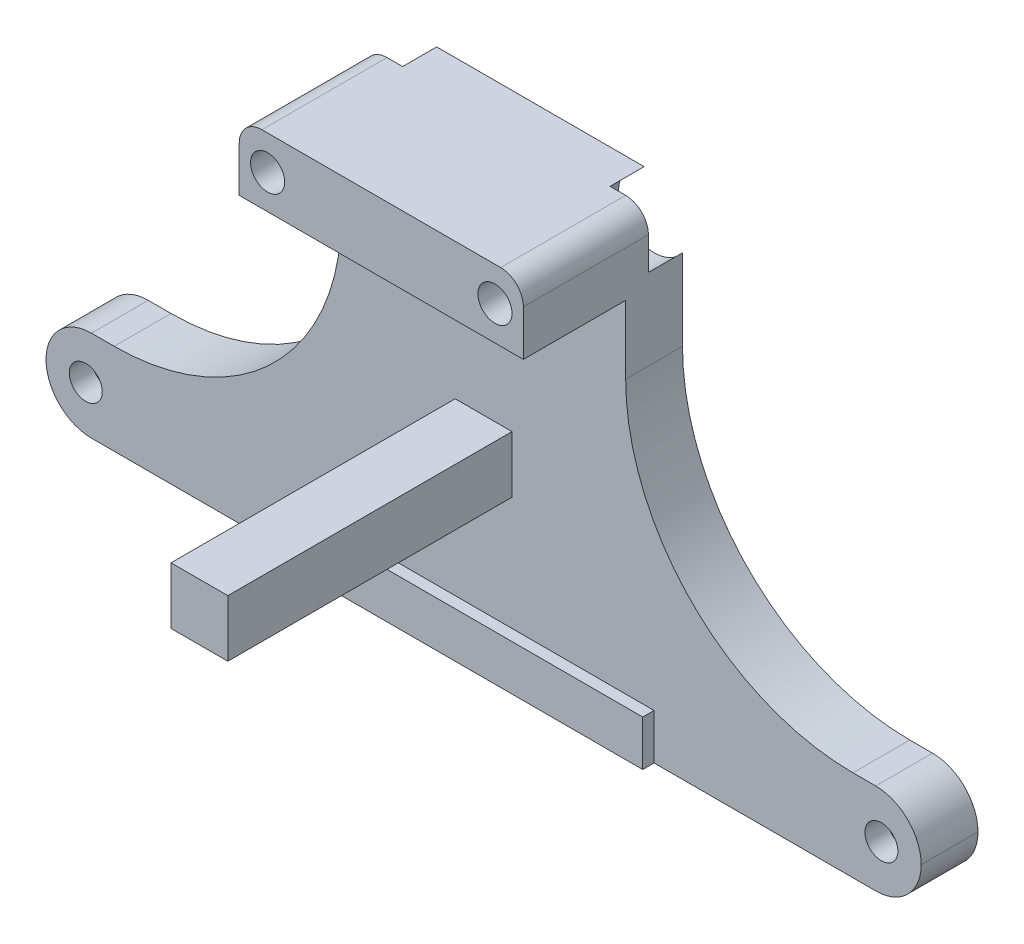
ISO-10303-21;
HEADER;
FILE_DESCRIPTION(('STEP AP214'),'2;1');
FILE_NAME('part.step','',(''),(''),'','','');
FILE_SCHEMA(('AUTOMOTIVE_DESIGN { 1 0 10303 214 1 1 1 1 }'));
ENDSEC;
DATA;
#1=APPLICATION_CONTEXT('core data for automotive mechanical design processes');
#2=APPLICATION_PROTOCOL_DEFINITION('international standard','automotive_design',2000,#1);
#3=PRODUCT_CONTEXT('',#1,'mechanical');
#4=PRODUCT('Part','Part','',(#3));
#5=PRODUCT_RELATED_PRODUCT_CATEGORY('part','',(#4));
#6=PRODUCT_DEFINITION_FORMATION('','',#4);
#7=PRODUCT_DEFINITION_CONTEXT('part definition',#1,'design');
#8=PRODUCT_DEFINITION('design','',#6,#7);
#9=PRODUCT_DEFINITION_SHAPE('','',#8);
#10=(LENGTH_UNIT() NAMED_UNIT(*) SI_UNIT(.MILLI.,.METRE.));
#11=(NAMED_UNIT(*) PLANE_ANGLE_UNIT() SI_UNIT($,.RADIAN.));
#12=(NAMED_UNIT(*) SI_UNIT($,.STERADIAN.) SOLID_ANGLE_UNIT());
#13=UNCERTAINTY_MEASURE_WITH_UNIT(LENGTH_MEASURE(1.E-05),#10,'distance_accuracy_value','');
#14=(GEOMETRIC_REPRESENTATION_CONTEXT(3) GLOBAL_UNCERTAINTY_ASSIGNED_CONTEXT((#13)) GLOBAL_UNIT_ASSIGNED_CONTEXT((#10,
#11,#12)) REPRESENTATION_CONTEXT('',''));
#15=CARTESIAN_POINT('',(0.,0.,0.));
#16=DIRECTION('',(0.,0.,1.));
#17=DIRECTION('',(1.,0.,0.));
#18=AXIS2_PLACEMENT_3D('',#15,#16,#17);
#19=CARTESIAN_POINT('',(0.,0.,5.));
#20=DIRECTION('',(0.,0.,-1.));
#21=DIRECTION('',(-1.,0.,0.));
#22=AXIS2_PLACEMENT_3D('',#19,#20,#21);
#23=PLANE('',#22);
#24=DIRECTION('',(0.,1.,0.));
#25=VECTOR('',#24,1.);
#26=CARTESIAN_POINT('',(15.,-4.,5.));
#27=LINE('',#26,#25);
#28=CARTESIAN_POINT('',(15.,-4.,5.));
#29=VERTEX_POINT('',#28);
#30=CARTESIAN_POINT('',(15.,0.,5.));
#31=VERTEX_POINT('',#30);
#32=EDGE_CURVE('E246',#29,#31,#27,.T.);
#33=ORIENTED_EDGE('',*,*,#32,.F.);
#34=DIRECTION('',(1.,0.,0.));
#35=VECTOR('',#34,1.);
#36=CARTESIAN_POINT('',(-38.5,-4.,5.));
#37=LINE('',#36,#35);
#38=CARTESIAN_POINT('',(34.5,-4.,5.));
#39=VERTEX_POINT('',#38);
#40=EDGE_CURVE('E374',#29,#39,#37,.T.);
#41=ORIENTED_EDGE('',*,*,#40,.T.);
#42=CARTESIAN_POINT('',(34.5,0.,5.));
#43=DIRECTION('',(0.,0.,-1.));
#44=DIRECTION('',(-1.,0.,0.));
#45=AXIS2_PLACEMENT_3D('',#42,#43,#44);
#46=CIRCLE('',#45,4.);
#47=CARTESIAN_POINT('',(38.5,0.,5.));
#48=VERTEX_POINT('',#47);
#49=EDGE_CURVE('E419',#39,#48,#46,.F.);
#50=ORIENTED_EDGE('',*,*,#49,.T.);
#51=CARTESIAN_POINT('',(34.5,0.,5.));
#52=DIRECTION('',(0.,0.,-1.));
#53=DIRECTION('',(-1.,0.,0.));
#54=AXIS2_PLACEMENT_3D('',#51,#52,#53);
#55=CIRCLE('',#54,4.);
#56=CARTESIAN_POINT('',(34.5,4.,5.));
#57=VERTEX_POINT('',#56);
#58=EDGE_CURVE('E417',#48,#57,#55,.F.);
#59=ORIENTED_EDGE('',*,*,#58,.T.);
#60=DIRECTION('',(-1.,0.,0.));
#61=VECTOR('',#60,1.);
#62=CARTESIAN_POINT('',(-38.5,4.,5.));
#63=LINE('',#62,#61);
#64=CARTESIAN_POINT('',(32.5,4.,5.));
#65=VERTEX_POINT('',#64);
#66=EDGE_CURVE('E372',#57,#65,#63,.T.);
#67=ORIENTED_EDGE('',*,*,#66,.T.);
#68=CARTESIAN_POINT('',(32.5,24.,5.));
#69=DIRECTION('',(0.,0.,-1.));
#70=DIRECTION('',(-1.,0.,0.));
#71=AXIS2_PLACEMENT_3D('',#68,#69,#70);
#72=CIRCLE('',#71,20.);
#73=CARTESIAN_POINT('',(12.5,24.,5.));
#74=VERTEX_POINT('',#73);
#75=EDGE_CURVE('E397',#65,#74,#72,.T.);
#76=ORIENTED_EDGE('',*,*,#75,.T.);
#77=DIRECTION('',(0.,-1.,0.));
#78=VECTOR('',#77,1.);
#79=CARTESIAN_POINT('',(12.5,4.,5.));
#80=LINE('',#79,#78);
#81=CARTESIAN_POINT('',(12.5,30.,5.));
#82=VERTEX_POINT('',#81);
#83=EDGE_CURVE('E353',#82,#74,#80,.T.);
#84=ORIENTED_EDGE('',*,*,#83,.F.);
#85=DIRECTION('',(-1.,0.,0.));
#86=VECTOR('',#85,1.);
#87=CARTESIAN_POINT('',(12.5,30.,5.));
#88=LINE('',#87,#86);
#89=CARTESIAN_POINT('',(-12.5,30.,5.));
#90=VERTEX_POINT('',#89);
#91=EDGE_CURVE('E333',#82,#90,#88,.T.);
#92=ORIENTED_EDGE('',*,*,#91,.T.);
#93=DIRECTION('',(0.,1.,0.));
#94=VECTOR('',#93,1.);
#95=CARTESIAN_POINT('',(-12.5,4.,5.));
#96=LINE('',#95,#94);
#97=CARTESIAN_POINT('',(-12.5,24.,5.));
#98=VERTEX_POINT('',#97);
#99=EDGE_CURVE('E356',#98,#90,#96,.T.);
#100=ORIENTED_EDGE('',*,*,#99,.F.);
#101=CARTESIAN_POINT('',(-32.5,24.,5.));
#102=DIRECTION('',(0.,0.,-1.));
#103=DIRECTION('',(-1.,0.,0.));
#104=AXIS2_PLACEMENT_3D('',#101,#102,#103);
#105=CIRCLE('',#104,20.);
#106=CARTESIAN_POINT('',(-32.5,4.,5.));
#107=VERTEX_POINT('',#106);
#108=EDGE_CURVE('E401',#98,#107,#105,.T.);
#109=ORIENTED_EDGE('',*,*,#108,.T.);
#110=CARTESIAN_POINT('',(-34.5,4.,5.));
#111=VERTEX_POINT('',#110);
#112=EDGE_CURVE('E375',#107,#111,#63,.T.);
#113=ORIENTED_EDGE('',*,*,#112,.T.);
#114=CARTESIAN_POINT('',(-34.5,0.,5.));
#115=DIRECTION('',(0.,0.,-1.));
#116=DIRECTION('',(-1.,0.,0.));
#117=AXIS2_PLACEMENT_3D('',#114,#115,#116);
#118=CIRCLE('',#117,4.);
#119=CARTESIAN_POINT('',(-38.5,0.,5.));
#120=VERTEX_POINT('',#119);
#121=EDGE_CURVE('E421',#111,#120,#118,.F.);
#122=ORIENTED_EDGE('',*,*,#121,.T.);
#123=CARTESIAN_POINT('',(-34.5,0.,5.));
#124=DIRECTION('',(0.,0.,-1.));
#125=DIRECTION('',(-1.,0.,0.));
#126=AXIS2_PLACEMENT_3D('',#123,#124,#125);
#127=CIRCLE('',#126,4.);
#128=CARTESIAN_POINT('',(-34.5,-4.,5.));
#129=VERTEX_POINT('',#128);
#130=EDGE_CURVE('E423',#120,#129,#127,.F.);
#131=ORIENTED_EDGE('',*,*,#130,.T.);
#132=CARTESIAN_POINT('',(-15.,-4.,5.));
#133=VERTEX_POINT('',#132);
#134=EDGE_CURVE('E376',#129,#133,#37,.T.);
#135=ORIENTED_EDGE('',*,*,#134,.T.);
#136=DIRECTION('',(0.,-1.,0.));
#137=VECTOR('',#136,1.);
#138=CARTESIAN_POINT('',(-15.,-4.,5.));
#139=LINE('',#138,#137);
#140=CARTESIAN_POINT('',(-15.,0.,5.));
#141=VERTEX_POINT('',#140);
#142=EDGE_CURVE('E259',#141,#133,#139,.T.);
#143=ORIENTED_EDGE('',*,*,#142,.F.);
#144=DIRECTION('',(-1.,0.,0.));
#145=VECTOR('',#144,1.);
#146=CARTESIAN_POINT('',(15.,0.,5.));
#147=LINE('',#146,#145);
#148=EDGE_CURVE('E249',#31,#141,#147,.T.);
#149=ORIENTED_EDGE('',*,*,#148,.F.);
#150=EDGE_LOOP('',(#33,#41,#50,#59,#67,#76,#84,#92,#100,#109,#113,#122,#131,#135,#143,#149));
#151=FACE_BOUND('',#150,.T.);
#152=CARTESIAN_POINT('',(-35.,0.,5.));
#153=DIRECTION('',(0.,0.,1.));
#154=DIRECTION('',(1.,0.,0.));
#155=AXIS2_PLACEMENT_3D('',#152,#153,#154);
#156=CIRCLE('',#155,1.45);
#157=CARTESIAN_POINT('',(-33.55,0.,5.));
#158=VERTEX_POINT('',#157);
#159=EDGE_CURVE('E368',#158,#158,#156,.T.);
#160=ORIENTED_EDGE('',*,*,#159,.F.);
#161=EDGE_LOOP('',(#160));
#162=FACE_BOUND('',#161,.T.);
#163=CARTESIAN_POINT('',(35.,0.,5.));
#164=DIRECTION('',(0.,0.,1.));
#165=DIRECTION('',(1.,0.,0.));
#166=AXIS2_PLACEMENT_3D('',#163,#164,#165);
#167=CIRCLE('',#166,1.45);
#168=CARTESIAN_POINT('',(36.45,0.,5.));
#169=VERTEX_POINT('',#168);
#170=EDGE_CURVE('E359',#169,#169,#167,.T.);
#171=ORIENTED_EDGE('',*,*,#170,.F.);
#172=EDGE_LOOP('',(#171));
#173=FACE_BOUND('',#172,.T.);
#174=DIRECTION('',(0.,-1.,0.));
#175=VECTOR('',#174,1.);
#176=CARTESIAN_POINT('',(-2.5,15.,5.));
#177=LINE('',#176,#175);
#178=CARTESIAN_POINT('',(-2.5,15.,5.));
#179=VERTEX_POINT('',#178);
#180=CARTESIAN_POINT('',(-2.5,10.,5.));
#181=VERTEX_POINT('',#180);
#182=EDGE_CURVE('E245',#179,#181,#177,.T.);
#183=ORIENTED_EDGE('',*,*,#182,.F.);
#184=DIRECTION('',(-1.,0.,0.));
#185=VECTOR('',#184,1.);
#186=CARTESIAN_POINT('',(-2.5,15.,5.));
#187=LINE('',#186,#185);
#188=CARTESIAN_POINT('',(2.5,15.,5.));
#189=VERTEX_POINT('',#188);
#190=EDGE_CURVE('E242',#189,#179,#187,.T.);
#191=ORIENTED_EDGE('',*,*,#190,.F.);
#192=DIRECTION('',(0.,1.,0.));
#193=VECTOR('',#192,1.);
#194=CARTESIAN_POINT('',(2.5,15.,5.));
#195=LINE('',#194,#193);
#196=CARTESIAN_POINT('',(2.5,10.,5.));
#197=VERTEX_POINT('',#196);
#198=EDGE_CURVE('E61',#197,#189,#195,.T.);
#199=ORIENTED_EDGE('',*,*,#198,.F.);
#200=DIRECTION('',(1.,0.,0.));
#201=VECTOR('',#200,1.);
#202=CARTESIAN_POINT('',(-2.5,10.,5.));
#203=LINE('',#202,#201);
#204=EDGE_CURVE('E56',#181,#197,#203,.T.);
#205=ORIENTED_EDGE('',*,*,#204,.F.);
#206=EDGE_LOOP('',(#183,#191,#199,#205));
#207=FACE_BOUND('',#206,.T.);
#208=ADVANCED_FACE('F39',(#151,#162,#173,#207),#23,.F.);
#209=CARTESIAN_POINT('',(-35.,0.,5.));
#210=DIRECTION('',(0.,0.,-1.));
#211=DIRECTION('',(-1.,0.,0.));
#212=AXIS2_PLACEMENT_3D('',#209,#210,#211);
#213=CYLINDRICAL_SURFACE('',#212,1.45);
#214=ORIENTED_EDGE('',*,*,#159,.T.);
#215=EDGE_LOOP('',(#214));
#216=FACE_BOUND('',#215,.T.);
#217=CARTESIAN_POINT('',(-35.,0.,3.));
#218=DIRECTION('',(0.,0.,-1.));
#219=DIRECTION('',(-1.,0.,0.));
#220=AXIS2_PLACEMENT_3D('',#217,#218,#219);
#221=CIRCLE('',#220,1.45);
#222=CARTESIAN_POINT('',(-36.45,0.,3.));
#223=VERTEX_POINT('',#222);
#224=EDGE_CURVE('E43',#223,#223,#221,.T.);
#225=ORIENTED_EDGE('',*,*,#224,.T.);
#226=EDGE_LOOP('',(#225));
#227=FACE_BOUND('',#226,.T.);
#228=ADVANCED_FACE('F460',(#216,#227),#213,.F.);
#229=CARTESIAN_POINT('',(35.,0.,5.));
#230=DIRECTION('',(0.,0.,-1.));
#231=DIRECTION('',(-1.,0.,0.));
#232=AXIS2_PLACEMENT_3D('',#229,#230,#231);
#233=CYLINDRICAL_SURFACE('',#232,1.45);
#234=ORIENTED_EDGE('',*,*,#170,.T.);
#235=EDGE_LOOP('',(#234));
#236=FACE_BOUND('',#235,.T.);
#237=CARTESIAN_POINT('',(35.,0.,3.));
#238=DIRECTION('',(0.,0.,-1.));
#239=DIRECTION('',(-1.,0.,0.));
#240=AXIS2_PLACEMENT_3D('',#237,#238,#239);
#241=CIRCLE('',#240,1.45);
#242=CARTESIAN_POINT('',(33.55,0.,3.));
#243=VERTEX_POINT('',#242);
#244=EDGE_CURVE('E325',#243,#243,#241,.T.);
#245=ORIENTED_EDGE('',*,*,#244,.T.);
#246=EDGE_LOOP('',(#245));
#247=FACE_BOUND('',#246,.T.);
#248=ADVANCED_FACE('F591',(#236,#247),#233,.F.);
#249=CARTESIAN_POINT('',(10.,32.9999999999999,5.));
#250=DIRECTION('',(0.,0.,-1.));
#251=DIRECTION('',(-1.,0.,0.));
#252=AXIS2_PLACEMENT_3D('',#249,#250,#251);
#253=CYLINDRICAL_SURFACE('',#252,1.5);
#254=CARTESIAN_POINT('',(10.,32.9999999999999,14.));
#255=DIRECTION('',(0.,0.,-1.));
#256=DIRECTION('',(-1.,0.,0.));
#257=AXIS2_PLACEMENT_3D('',#254,#255,#256);
#258=CIRCLE('',#257,1.5);
#259=CARTESIAN_POINT('',(8.5,32.9999999999999,14.));
#260=VERTEX_POINT('',#259);
#261=EDGE_CURVE('E326',#260,#260,#258,.T.);
#262=ORIENTED_EDGE('',*,*,#261,.F.);
#263=EDGE_LOOP('',(#262));
#264=FACE_BOUND('',#263,.T.);
#265=CARTESIAN_POINT('',(10.,32.9999999999999,3.));
#266=DIRECTION('',(0.,0.,-1.));
#267=DIRECTION('',(-1.,0.,0.));
#268=AXIS2_PLACEMENT_3D('',#265,#266,#267);
#269=CIRCLE('',#268,1.5);
#270=CARTESIAN_POINT('',(8.5,32.9999999999999,3.));
#271=VERTEX_POINT('',#270);
#272=EDGE_CURVE('E318',#271,#271,#269,.F.);
#273=ORIENTED_EDGE('',*,*,#272,.F.);
#274=EDGE_LOOP('',(#273));
#275=FACE_BOUND('',#274,.T.);
#276=ADVANCED_FACE('F584',(#264,#275),#253,.F.);
#277=CARTESIAN_POINT('',(-10.,33.,5.));
#278=DIRECTION('',(0.,0.,-1.));
#279=DIRECTION('',(-1.,0.,0.));
#280=AXIS2_PLACEMENT_3D('',#277,#278,#279);
#281=CYLINDRICAL_SURFACE('',#280,1.5);
#282=CARTESIAN_POINT('',(-10.,33.,14.));
#283=DIRECTION('',(0.,0.,-1.));
#284=DIRECTION('',(-1.,0.,0.));
#285=AXIS2_PLACEMENT_3D('',#282,#283,#284);
#286=CIRCLE('',#285,1.5);
#287=CARTESIAN_POINT('',(-11.5,33.,14.));
#288=VERTEX_POINT('',#287);
#289=EDGE_CURVE('E329',#288,#288,#286,.T.);
#290=ORIENTED_EDGE('',*,*,#289,.F.);
#291=EDGE_LOOP('',(#290));
#292=FACE_BOUND('',#291,.T.);
#293=CARTESIAN_POINT('',(-10.,33.,3.));
#294=DIRECTION('',(0.,0.,-1.));
#295=DIRECTION('',(-1.,0.,0.));
#296=AXIS2_PLACEMENT_3D('',#293,#294,#295);
#297=CIRCLE('',#296,1.5);
#298=CARTESIAN_POINT('',(-11.5,33.,3.));
#299=VERTEX_POINT('',#298);
#300=EDGE_CURVE('E309',#299,#299,#297,.F.);
#301=ORIENTED_EDGE('',*,*,#300,.F.);
#302=EDGE_LOOP('',(#301));
#303=FACE_BOUND('',#302,.T.);
#304=ADVANCED_FACE('F582',(#292,#303),#281,.F.);
#305=CARTESIAN_POINT('',(10.5,34.,5.));
#306=DIRECTION('',(0.,0.,-1.));
#307=DIRECTION('',(-1.,0.,0.));
#308=AXIS2_PLACEMENT_3D('',#305,#306,#307);
#309=CYLINDRICAL_SURFACE('',#308,2.);
#310=DIRECTION('',(0.,0.,-1.));
#311=VECTOR('',#310,1.);
#312=CARTESIAN_POINT('',(12.5,34.,5.));
#313=LINE('',#312,#311);
#314=CARTESIAN_POINT('',(12.5,34.,3.));
#315=VERTEX_POINT('',#314);
#316=CARTESIAN_POINT('',(12.5,34.,14.));
#317=VERTEX_POINT('',#316);
#318=EDGE_CURVE('E439',#315,#317,#313,.F.);
#319=ORIENTED_EDGE('',*,*,#318,.F.);
#320=CARTESIAN_POINT('',(10.5,34.,3.));
#321=DIRECTION('',(0.,0.,-1.));
#322=DIRECTION('',(-1.,0.,0.));
#323=AXIS2_PLACEMENT_3D('',#320,#321,#322);
#324=CIRCLE('',#323,2.);
#325=CARTESIAN_POINT('',(10.5,36.,3.));
#326=VERTEX_POINT('',#325);
#327=EDGE_CURVE('E451',#315,#326,#324,.F.);
#328=ORIENTED_EDGE('',*,*,#327,.T.);
#329=DIRECTION('',(0.,0.,-1.));
#330=VECTOR('',#329,1.);
#331=CARTESIAN_POINT('',(10.5,36.,5.));
#332=LINE('',#331,#330);
#333=CARTESIAN_POINT('',(10.5,36.,14.));
#334=VERTEX_POINT('',#333);
#335=EDGE_CURVE('E436',#334,#326,#332,.T.);
#336=ORIENTED_EDGE('',*,*,#335,.F.);
#337=CARTESIAN_POINT('',(10.5,34.,14.));
#338=DIRECTION('',(0.,0.,-1.));
#339=DIRECTION('',(-1.,0.,0.));
#340=AXIS2_PLACEMENT_3D('',#337,#338,#339);
#341=CIRCLE('',#340,2.);
#342=EDGE_CURVE('E443',#317,#334,#341,.F.);
#343=ORIENTED_EDGE('',*,*,#342,.F.);
#344=EDGE_LOOP('',(#319,#328,#336,#343));
#345=FACE_BOUND('',#344,.T.);
#346=ADVANCED_FACE('F508',(#345),#309,.T.);
#347=CARTESIAN_POINT('',(-10.5,34.,5.));
#348=DIRECTION('',(0.,0.,-1.));
#349=DIRECTION('',(-1.,0.,0.));
#350=AXIS2_PLACEMENT_3D('',#347,#348,#349);
#351=CYLINDRICAL_SURFACE('',#350,2.);
#352=DIRECTION('',(0.,0.,-1.));
#353=VECTOR('',#352,1.);
#354=CARTESIAN_POINT('',(-10.5,36.,5.));
#355=LINE('',#354,#353);
#356=CARTESIAN_POINT('',(-10.5,36.,3.));
#357=VERTEX_POINT('',#356);
#358=CARTESIAN_POINT('',(-10.5,36.,14.));
#359=VERTEX_POINT('',#358);
#360=EDGE_CURVE('E429',#357,#359,#355,.F.);
#361=ORIENTED_EDGE('',*,*,#360,.F.);
#362=CARTESIAN_POINT('',(-10.5,34.,3.));
#363=DIRECTION('',(0.,0.,-1.));
#364=DIRECTION('',(-1.,0.,0.));
#365=AXIS2_PLACEMENT_3D('',#362,#363,#364);
#366=CIRCLE('',#365,2.);
#367=CARTESIAN_POINT('',(-12.5,34.,3.));
#368=VERTEX_POINT('',#367);
#369=EDGE_CURVE('E448',#357,#368,#366,.F.);
#370=ORIENTED_EDGE('',*,*,#369,.T.);
#371=DIRECTION('',(0.,0.,-1.));
#372=VECTOR('',#371,1.);
#373=CARTESIAN_POINT('',(-12.5,34.,5.));
#374=LINE('',#373,#372);
#375=CARTESIAN_POINT('',(-12.5,34.,14.));
#376=VERTEX_POINT('',#375);
#377=EDGE_CURVE('E445',#376,#368,#374,.T.);
#378=ORIENTED_EDGE('',*,*,#377,.F.);
#379=CARTESIAN_POINT('',(-10.5,34.,14.));
#380=DIRECTION('',(0.,0.,-1.));
#381=DIRECTION('',(-1.,0.,0.));
#382=AXIS2_PLACEMENT_3D('',#379,#380,#381);
#383=CIRCLE('',#382,2.);
#384=EDGE_CURVE('E441',#359,#376,#383,.F.);
#385=ORIENTED_EDGE('',*,*,#384,.F.);
#386=EDGE_LOOP('',(#361,#370,#378,#385));
#387=FACE_BOUND('',#386,.T.);
#388=ADVANCED_FACE('F41',(#387),#351,.T.);
#389=CARTESIAN_POINT('',(-38.5,4.,5.));
#390=DIRECTION('',(0.,-1.,0.));
#391=DIRECTION('',(0.,0.,-1.));
#392=AXIS2_PLACEMENT_3D('',#389,#390,#391);
#393=PLANE('',#392);
#394=ORIENTED_EDGE('',*,*,#66,.F.);
#395=DIRECTION('',(0.,0.,-1.));
#396=VECTOR('',#395,1.);
#397=CARTESIAN_POINT('',(34.5,4.,5.));
#398=LINE('',#397,#396);
#399=CARTESIAN_POINT('',(34.5,4.,0.));
#400=VERTEX_POINT('',#399);
#401=EDGE_CURVE('E427',#57,#400,#398,.T.);
#402=ORIENTED_EDGE('',*,*,#401,.T.);
#403=DIRECTION('',(-1.,0.,0.));
#404=VECTOR('',#403,1.);
#405=CARTESIAN_POINT('',(-38.5,4.,0.));
#406=LINE('',#405,#404);
#407=CARTESIAN_POINT('',(32.5,4.,0.));
#408=VERTEX_POINT('',#407);
#409=EDGE_CURVE('E379',#400,#408,#406,.T.);
#410=ORIENTED_EDGE('',*,*,#409,.T.);
#411=DIRECTION('',(0.,0.,-1.));
#412=VECTOR('',#411,1.);
#413=CARTESIAN_POINT('',(32.5,4.,5.));
#414=LINE('',#413,#412);
#415=EDGE_CURVE('E386',#408,#65,#414,.F.);
#416=ORIENTED_EDGE('',*,*,#415,.T.);
#417=EDGE_LOOP('',(#394,#402,#410,#416));
#418=FACE_BOUND('',#417,.T.);
#419=ADVANCED_FACE('F480',(#418),#393,.F.);
#420=CARTESIAN_POINT('',(0.,0.,0.));
#421=DIRECTION('',(0.,0.,-1.));
#422=DIRECTION('',(-1.,0.,0.));
#423=AXIS2_PLACEMENT_3D('',#420,#421,#422);
#424=PLANE('',#423);
#425=CARTESIAN_POINT('',(-35.,0.,0.));
#426=DIRECTION('',(0.,0.,-1.));
#427=DIRECTION('',(-1.,0.,0.));
#428=AXIS2_PLACEMENT_3D('',#425,#426,#427);
#429=CIRCLE('',#428,3.125);
#430=CARTESIAN_POINT('',(-38.125,0.,0.));
#431=VERTEX_POINT('',#430);
#432=EDGE_CURVE('E294',#431,#431,#429,.T.);
#433=ORIENTED_EDGE('',*,*,#432,.F.);
#434=EDGE_LOOP('',(#433));
#435=FACE_BOUND('',#434,.T.);
#436=CARTESIAN_POINT('',(35.,0.,0.));
#437=DIRECTION('',(0.,0.,-1.));
#438=DIRECTION('',(-1.,0.,0.));
#439=AXIS2_PLACEMENT_3D('',#436,#437,#438);
#440=CIRCLE('',#439,3.125);
#441=CARTESIAN_POINT('',(31.875,0.,0.));
#442=VERTEX_POINT('',#441);
#443=EDGE_CURVE('E288',#442,#442,#440,.T.);
#444=ORIENTED_EDGE('',*,*,#443,.F.);
#445=EDGE_LOOP('',(#444));
#446=FACE_BOUND('',#445,.T.);
#447=CARTESIAN_POINT('',(-10.,33.,0.));
#448=DIRECTION('',(0.,0.,-1.));
#449=DIRECTION('',(-1.,0.,0.));
#450=AXIS2_PLACEMENT_3D('',#447,#448,#449);
#451=CIRCLE('',#450,3.125);
#452=CARTESIAN_POINT('',(-9.12500000000001,36.,0.));
#453=VERTEX_POINT('',#452);
#454=CARTESIAN_POINT('',(-12.5,31.125,0.));
#455=VERTEX_POINT('',#454);
#456=EDGE_CURVE('E282',#453,#455,#451,.T.);
#457=ORIENTED_EDGE('',*,*,#456,.F.);
#458=DIRECTION('',(1.,0.,0.));
#459=VECTOR('',#458,1.);
#460=CARTESIAN_POINT('',(12.5,36.,0.));
#461=LINE('',#460,#459);
#462=CARTESIAN_POINT('',(9.12500000000029,36.,0.));
#463=VERTEX_POINT('',#462);
#464=EDGE_CURVE('E357',#453,#463,#461,.T.);
#465=ORIENTED_EDGE('',*,*,#464,.T.);
#466=CARTESIAN_POINT('',(10.,32.9999999999999,0.));
#467=DIRECTION('',(0.,0.,-1.));
#468=DIRECTION('',(-1.,0.,0.));
#469=AXIS2_PLACEMENT_3D('',#466,#467,#468);
#470=CIRCLE('',#469,3.125);
#471=CARTESIAN_POINT('',(12.5,31.1249999999999,0.));
#472=VERTEX_POINT('',#471);
#473=EDGE_CURVE('E284',#472,#463,#470,.T.);
#474=ORIENTED_EDGE('',*,*,#473,.F.);
#475=DIRECTION('',(0.,-1.,0.));
#476=VECTOR('',#475,1.);
#477=CARTESIAN_POINT('',(12.5,4.,0.));
#478=LINE('',#477,#476);
#479=CARTESIAN_POINT('',(12.5,24.,0.));
#480=VERTEX_POINT('',#479);
#481=EDGE_CURVE('E351',#472,#480,#478,.T.);
#482=ORIENTED_EDGE('',*,*,#481,.T.);
#483=CARTESIAN_POINT('',(32.5,24.,0.));
#484=DIRECTION('',(0.,0.,-1.));
#485=DIRECTION('',(-1.,0.,0.));
#486=AXIS2_PLACEMENT_3D('',#483,#484,#485);
#487=CIRCLE('',#486,20.);
#488=EDGE_CURVE('E394',#480,#408,#487,.F.);
#489=ORIENTED_EDGE('',*,*,#488,.T.);
#490=ORIENTED_EDGE('',*,*,#409,.F.);
#491=CARTESIAN_POINT('',(34.5,0.,0.));
#492=DIRECTION('',(0.,0.,-1.));
#493=DIRECTION('',(-1.,0.,0.));
#494=AXIS2_PLACEMENT_3D('',#491,#492,#493);
#495=CIRCLE('',#494,4.);
#496=CARTESIAN_POINT('',(38.5,0.,0.));
#497=VERTEX_POINT('',#496);
#498=EDGE_CURVE('E409',#400,#497,#495,.T.);
#499=ORIENTED_EDGE('',*,*,#498,.T.);
#500=CARTESIAN_POINT('',(34.5,0.,0.));
#501=DIRECTION('',(0.,0.,-1.));
#502=DIRECTION('',(-1.,0.,0.));
#503=AXIS2_PLACEMENT_3D('',#500,#501,#502);
#504=CIRCLE('',#503,4.);
#505=CARTESIAN_POINT('',(34.5,-4.,0.));
#506=VERTEX_POINT('',#505);
#507=EDGE_CURVE('E411',#497,#506,#504,.T.);
#508=ORIENTED_EDGE('',*,*,#507,.T.);
#509=DIRECTION('',(1.,0.,0.));
#510=VECTOR('',#509,1.);
#511=CARTESIAN_POINT('',(-38.5,-4.,0.));
#512=LINE('',#511,#510);
#513=CARTESIAN_POINT('',(-34.5,-4.,0.));
#514=VERTEX_POINT('',#513);
#515=EDGE_CURVE('E381',#514,#506,#512,.T.);
#516=ORIENTED_EDGE('',*,*,#515,.F.);
#517=CARTESIAN_POINT('',(-34.5,0.,0.));
#518=DIRECTION('',(0.,0.,-1.));
#519=DIRECTION('',(-1.,0.,0.));
#520=AXIS2_PLACEMENT_3D('',#517,#518,#519);
#521=CIRCLE('',#520,4.);
#522=CARTESIAN_POINT('',(-38.5,0.,0.));
#523=VERTEX_POINT('',#522);
#524=EDGE_CURVE('E415',#514,#523,#521,.T.);
#525=ORIENTED_EDGE('',*,*,#524,.T.);
#526=CARTESIAN_POINT('',(-34.5,0.,0.));
#527=DIRECTION('',(0.,0.,-1.));
#528=DIRECTION('',(-1.,0.,0.));
#529=AXIS2_PLACEMENT_3D('',#526,#527,#528);
#530=CIRCLE('',#529,4.);
#531=CARTESIAN_POINT('',(-34.5,4.,0.));
#532=VERTEX_POINT('',#531);
#533=EDGE_CURVE('E413',#523,#532,#530,.T.);
#534=ORIENTED_EDGE('',*,*,#533,.T.);
#535=CARTESIAN_POINT('',(-32.5,4.,0.));
#536=VERTEX_POINT('',#535);
#537=EDGE_CURVE('E371',#536,#532,#406,.T.);
#538=ORIENTED_EDGE('',*,*,#537,.F.);
#539=CARTESIAN_POINT('',(-32.5,24.,0.));
#540=DIRECTION('',(0.,0.,-1.));
#541=DIRECTION('',(-1.,0.,0.));
#542=AXIS2_PLACEMENT_3D('',#539,#540,#541);
#543=CIRCLE('',#542,20.);
#544=CARTESIAN_POINT('',(-12.5,24.,0.));
#545=VERTEX_POINT('',#544);
#546=EDGE_CURVE('E399',#536,#545,#543,.F.);
#547=ORIENTED_EDGE('',*,*,#546,.T.);
#548=DIRECTION('',(0.,1.,0.));
#549=VECTOR('',#548,1.);
#550=CARTESIAN_POINT('',(-12.5,4.,0.));
#551=LINE('',#550,#549);
#552=EDGE_CURVE('E361',#545,#455,#551,.T.);
#553=ORIENTED_EDGE('',*,*,#552,.T.);
#554=EDGE_LOOP('',(#457,#465,#474,#482,#489,#490,#499,#508,#516,#525,#534,#538,#547,#553));
#555=FACE_BOUND('',#554,.T.);
#556=ADVANCED_FACE('F476',(#435,#446,#555),#424,.T.);
#557=ORIENTED_EDGE('',*,*,#537,.T.);
#558=DIRECTION('',(0.,0.,-1.));
#559=VECTOR('',#558,1.);
#560=CARTESIAN_POINT('',(-34.5,4.,5.));
#561=LINE('',#560,#559);
#562=EDGE_CURVE('E425',#532,#111,#561,.F.);
#563=ORIENTED_EDGE('',*,*,#562,.T.);
#564=ORIENTED_EDGE('',*,*,#112,.F.);
#565=DIRECTION('',(0.,0.,-1.));
#566=VECTOR('',#565,1.);
#567=CARTESIAN_POINT('',(-32.5,4.,5.));
#568=LINE('',#567,#566);
#569=EDGE_CURVE('E389',#107,#536,#568,.T.);
#570=ORIENTED_EDGE('',*,*,#569,.T.);
#571=EDGE_LOOP('',(#557,#563,#564,#570));
#572=FACE_BOUND('',#571,.T.);
#573=ADVANCED_FACE('F479',(#572),#393,.F.);
#574=CARTESIAN_POINT('',(-38.5,-4.,5.));
#575=DIRECTION('',(0.,1.,0.));
#576=DIRECTION('',(0.,0.,1.));
#577=AXIS2_PLACEMENT_3D('',#574,#575,#576);
#578=PLANE('',#577);
#579=ORIENTED_EDGE('',*,*,#134,.F.);
#580=DIRECTION('',(0.,0.,-1.));
#581=VECTOR('',#580,1.);
#582=CARTESIAN_POINT('',(-34.5,-4.,5.));
#583=LINE('',#582,#581);
#584=EDGE_CURVE('E406',#129,#514,#583,.T.);
#585=ORIENTED_EDGE('',*,*,#584,.T.);
#586=ORIENTED_EDGE('',*,*,#515,.T.);
#587=DIRECTION('',(0.,0.,-1.));
#588=VECTOR('',#587,1.);
#589=CARTESIAN_POINT('',(34.5,-4.,5.));
#590=LINE('',#589,#588);
#591=EDGE_CURVE('E403',#506,#39,#590,.F.);
#592=ORIENTED_EDGE('',*,*,#591,.T.);
#593=ORIENTED_EDGE('',*,*,#40,.F.);
#594=DIRECTION('',(0.,0.,-1.));
#595=VECTOR('',#594,1.);
#596=CARTESIAN_POINT('',(15.,-4.,6.));
#597=LINE('',#596,#595);
#598=CARTESIAN_POINT('',(15.,-4.,6.));
#599=VERTEX_POINT('',#598);
#600=EDGE_CURVE('E264',#599,#29,#597,.T.);
#601=ORIENTED_EDGE('',*,*,#600,.F.);
#602=DIRECTION('',(1.,0.,0.));
#603=VECTOR('',#602,1.);
#604=CARTESIAN_POINT('',(15.,-4.,6.));
#605=LINE('',#604,#603);
#606=CARTESIAN_POINT('',(-15.,-4.,6.));
#607=VERTEX_POINT('',#606);
#608=EDGE_CURVE('E263',#607,#599,#605,.T.);
#609=ORIENTED_EDGE('',*,*,#608,.F.);
#610=DIRECTION('',(0.,0.,-1.));
#611=VECTOR('',#610,1.);
#612=CARTESIAN_POINT('',(-15.,-4.,6.));
#613=LINE('',#612,#611);
#614=EDGE_CURVE('E272',#607,#133,#613,.T.);
#615=ORIENTED_EDGE('',*,*,#614,.T.);
#616=EDGE_LOOP('',(#579,#585,#586,#592,#593,#601,#609,#615));
#617=FACE_BOUND('',#616,.T.);
#618=ADVANCED_FACE('F553',(#617),#578,.F.);
#619=CARTESIAN_POINT('',(12.5,4.,5.));
#620=DIRECTION('',(1.,0.,0.));
#621=DIRECTION('',(0.,0.,-1.));
#622=AXIS2_PLACEMENT_3D('',#619,#620,#621);
#623=PLANE('',#622);
#624=DIRECTION('',(0.,0.,-1.));
#625=VECTOR('',#624,1.);
#626=CARTESIAN_POINT('',(12.5,31.1249999999999,3.));
#627=LINE('',#626,#625);
#628=CARTESIAN_POINT('',(12.5,31.1249999999999,3.));
#629=VERTEX_POINT('',#628);
#630=EDGE_CURVE('E323',#629,#472,#627,.T.);
#631=ORIENTED_EDGE('',*,*,#630,.F.);
#632=DIRECTION('',(0.,1.,0.));
#633=VECTOR('',#632,1.);
#634=CARTESIAN_POINT('',(12.5,4.,3.));
#635=LINE('',#634,#633);
#636=EDGE_CURVE('E315',#629,#315,#635,.T.);
#637=ORIENTED_EDGE('',*,*,#636,.T.);
#638=ORIENTED_EDGE('',*,*,#318,.T.);
#639=DIRECTION('',(0.,-1.,0.));
#640=VECTOR('',#639,1.);
#641=CARTESIAN_POINT('',(12.5,36.,14.));
#642=LINE('',#641,#640);
#643=CARTESIAN_POINT('',(12.5,30.,14.));
#644=VERTEX_POINT('',#643);
#645=EDGE_CURVE('E334',#317,#644,#642,.T.);
#646=ORIENTED_EDGE('',*,*,#645,.T.);
#647=DIRECTION('',(0.,0.,-1.));
#648=VECTOR('',#647,1.);
#649=CARTESIAN_POINT('',(12.5,30.,14.));
#650=LINE('',#649,#648);
#651=EDGE_CURVE('E345',#644,#82,#650,.T.);
#652=ORIENTED_EDGE('',*,*,#651,.T.);
#653=ORIENTED_EDGE('',*,*,#83,.T.);
#654=DIRECTION('',(0.,0.,-1.));
#655=VECTOR('',#654,1.);
#656=CARTESIAN_POINT('',(12.5,24.,5.));
#657=LINE('',#656,#655);
#658=EDGE_CURVE('E378',#74,#480,#657,.T.);
#659=ORIENTED_EDGE('',*,*,#658,.T.);
#660=ORIENTED_EDGE('',*,*,#481,.F.);
#661=EDGE_LOOP('',(#631,#637,#638,#646,#652,#653,#659,#660));
#662=FACE_BOUND('',#661,.T.);
#663=ADVANCED_FACE('F503',(#662),#623,.T.);
#664=CARTESIAN_POINT('',(12.5,36.,5.));
#665=DIRECTION('',(0.,1.,0.));
#666=DIRECTION('',(0.,0.,1.));
#667=AXIS2_PLACEMENT_3D('',#664,#665,#666);
#668=PLANE('',#667);
#669=DIRECTION('',(0.,0.,-1.));
#670=VECTOR('',#669,1.);
#671=CARTESIAN_POINT('',(-9.12500000000001,36.,3.));
#672=LINE('',#671,#670);
#673=CARTESIAN_POINT('',(-9.12500000000001,36.,3.));
#674=VERTEX_POINT('',#673);
#675=EDGE_CURVE('E321',#674,#453,#672,.T.);
#676=ORIENTED_EDGE('',*,*,#675,.F.);
#677=DIRECTION('',(-1.,0.,0.));
#678=VECTOR('',#677,1.);
#679=CARTESIAN_POINT('',(12.5,36.,3.));
#680=LINE('',#679,#678);
#681=EDGE_CURVE('E306',#674,#357,#680,.T.);
#682=ORIENTED_EDGE('',*,*,#681,.T.);
#683=ORIENTED_EDGE('',*,*,#360,.T.);
#684=DIRECTION('',(1.,0.,0.));
#685=VECTOR('',#684,1.);
#686=CARTESIAN_POINT('',(12.5,36.,14.));
#687=LINE('',#686,#685);
#688=EDGE_CURVE('E342',#359,#334,#687,.T.);
#689=ORIENTED_EDGE('',*,*,#688,.T.);
#690=ORIENTED_EDGE('',*,*,#335,.T.);
#691=DIRECTION('',(-1.,0.,0.));
#692=VECTOR('',#691,1.);
#693=CARTESIAN_POINT('',(12.5,36.,3.));
#694=LINE('',#693,#692);
#695=CARTESIAN_POINT('',(9.12500000000029,36.,3.));
#696=VERTEX_POINT('',#695);
#697=EDGE_CURVE('E312',#326,#696,#694,.T.);
#698=ORIENTED_EDGE('',*,*,#697,.T.);
#699=DIRECTION('',(0.,0.,-1.));
#700=VECTOR('',#699,1.);
#701=CARTESIAN_POINT('',(9.12500000000029,36.,3.));
#702=LINE('',#701,#700);
#703=EDGE_CURVE('E11',#463,#696,#702,.F.);
#704=ORIENTED_EDGE('',*,*,#703,.F.);
#705=ORIENTED_EDGE('',*,*,#464,.F.);
#706=EDGE_LOOP('',(#676,#682,#683,#689,#690,#698,#704,#705));
#707=FACE_BOUND('',#706,.T.);
#708=ADVANCED_FACE('F493',(#707),#668,.T.);
#709=CARTESIAN_POINT('',(-12.5,4.,5.));
#710=DIRECTION('',(-1.,0.,0.));
#711=DIRECTION('',(0.,0.,1.));
#712=AXIS2_PLACEMENT_3D('',#709,#710,#711);
#713=PLANE('',#712);
#714=DIRECTION('',(0.,0.,-1.));
#715=VECTOR('',#714,1.);
#716=CARTESIAN_POINT('',(-12.5,31.125,3.));
#717=LINE('',#716,#715);
#718=CARTESIAN_POINT('',(-12.5,31.125,3.));
#719=VERTEX_POINT('',#718);
#720=EDGE_CURVE('E48',#455,#719,#717,.F.);
#721=ORIENTED_EDGE('',*,*,#720,.F.);
#722=ORIENTED_EDGE('',*,*,#552,.F.);
#723=DIRECTION('',(0.,0.,-1.));
#724=VECTOR('',#723,1.);
#725=CARTESIAN_POINT('',(-12.5,24.,5.));
#726=LINE('',#725,#724);
#727=EDGE_CURVE('E392',#545,#98,#726,.F.);
#728=ORIENTED_EDGE('',*,*,#727,.T.);
#729=ORIENTED_EDGE('',*,*,#99,.T.);
#730=DIRECTION('',(0.,0.,-1.));
#731=VECTOR('',#730,1.);
#732=CARTESIAN_POINT('',(-12.5,30.,14.));
#733=LINE('',#732,#731);
#734=CARTESIAN_POINT('',(-12.5,30.,14.));
#735=VERTEX_POINT('',#734);
#736=EDGE_CURVE('E348',#735,#90,#733,.T.);
#737=ORIENTED_EDGE('',*,*,#736,.F.);
#738=DIRECTION('',(0.,1.,0.));
#739=VECTOR('',#738,1.);
#740=CARTESIAN_POINT('',(-12.5,36.,14.));
#741=LINE('',#740,#739);
#742=EDGE_CURVE('E339',#735,#376,#741,.T.);
#743=ORIENTED_EDGE('',*,*,#742,.T.);
#744=ORIENTED_EDGE('',*,*,#377,.T.);
#745=DIRECTION('',(0.,-1.,0.));
#746=VECTOR('',#745,1.);
#747=CARTESIAN_POINT('',(-12.5,4.,3.));
#748=LINE('',#747,#746);
#749=EDGE_CURVE('E302',#368,#719,#748,.T.);
#750=ORIENTED_EDGE('',*,*,#749,.T.);
#751=EDGE_LOOP('',(#721,#722,#728,#729,#737,#743,#744,#750));
#752=FACE_BOUND('',#751,.T.);
#753=ADVANCED_FACE('F520',(#752),#713,.T.);
#754=CARTESIAN_POINT('',(12.5,30.,14.));
#755=DIRECTION('',(0.,-1.,0.));
#756=DIRECTION('',(0.,0.,-1.));
#757=AXIS2_PLACEMENT_3D('',#754,#755,#756);
#758=PLANE('',#757);
#759=ORIENTED_EDGE('',*,*,#91,.F.);
#760=ORIENTED_EDGE('',*,*,#651,.F.);
#761=DIRECTION('',(-1.,0.,0.));
#762=VECTOR('',#761,1.);
#763=CARTESIAN_POINT('',(12.5,30.,14.));
#764=LINE('',#763,#762);
#765=EDGE_CURVE('E336',#644,#735,#764,.T.);
#766=ORIENTED_EDGE('',*,*,#765,.T.);
#767=ORIENTED_EDGE('',*,*,#736,.T.);
#768=EDGE_LOOP('',(#759,#760,#766,#767));
#769=FACE_BOUND('',#768,.T.);
#770=ADVANCED_FACE('F524',(#769),#758,.T.);
#771=CARTESIAN_POINT('',(0.,0.,14.));
#772=DIRECTION('',(0.,0.,-1.));
#773=DIRECTION('',(-1.,0.,0.));
#774=AXIS2_PLACEMENT_3D('',#771,#772,#773);
#775=PLANE('',#774);
#776=ORIENTED_EDGE('',*,*,#261,.T.);
#777=EDGE_LOOP('',(#776));
#778=FACE_BOUND('',#777,.T.);
#779=ORIENTED_EDGE('',*,*,#289,.T.);
#780=EDGE_LOOP('',(#779));
#781=FACE_BOUND('',#780,.T.);
#782=ORIENTED_EDGE('',*,*,#645,.F.);
#783=ORIENTED_EDGE('',*,*,#342,.T.);
#784=ORIENTED_EDGE('',*,*,#688,.F.);
#785=ORIENTED_EDGE('',*,*,#384,.T.);
#786=ORIENTED_EDGE('',*,*,#742,.F.);
#787=ORIENTED_EDGE('',*,*,#765,.F.);
#788=EDGE_LOOP('',(#782,#783,#784,#785,#786,#787));
#789=FACE_BOUND('',#788,.T.);
#790=ADVANCED_FACE('F512',(#778,#781,#789),#775,.F.);
#791=CARTESIAN_POINT('',(32.5,24.,5.));
#792=DIRECTION('',(0.,0.,-1.));
#793=DIRECTION('',(-1.,0.,0.));
#794=AXIS2_PLACEMENT_3D('',#791,#792,#793);
#795=CYLINDRICAL_SURFACE('',#794,20.);
#796=ORIENTED_EDGE('',*,*,#75,.F.);
#797=ORIENTED_EDGE('',*,*,#415,.F.);
#798=ORIENTED_EDGE('',*,*,#488,.F.);
#799=ORIENTED_EDGE('',*,*,#658,.F.);
#800=EDGE_LOOP('',(#796,#797,#798,#799));
#801=FACE_BOUND('',#800,.T.);
#802=ADVANCED_FACE('F535',(#801),#795,.F.);
#803=CARTESIAN_POINT('',(-32.5,24.,5.));
#804=DIRECTION('',(0.,0.,-1.));
#805=DIRECTION('',(-1.,0.,0.));
#806=AXIS2_PLACEMENT_3D('',#803,#804,#805);
#807=CYLINDRICAL_SURFACE('',#806,20.);
#808=ORIENTED_EDGE('',*,*,#108,.F.);
#809=ORIENTED_EDGE('',*,*,#727,.F.);
#810=ORIENTED_EDGE('',*,*,#546,.F.);
#811=ORIENTED_EDGE('',*,*,#569,.F.);
#812=EDGE_LOOP('',(#808,#809,#810,#811));
#813=FACE_BOUND('',#812,.T.);
#814=ADVANCED_FACE('F572',(#813),#807,.F.);
#815=CARTESIAN_POINT('',(-34.5,0.,5.));
#816=DIRECTION('',(0.,0.,-1.));
#817=DIRECTION('',(-1.,0.,0.));
#818=AXIS2_PLACEMENT_3D('',#815,#816,#817);
#819=CYLINDRICAL_SURFACE('',#818,4.);
#820=DIRECTION('',(0.,0.,-1.));
#821=VECTOR('',#820,1.);
#822=CARTESIAN_POINT('',(-38.5,0.,5.));
#823=LINE('',#822,#821);
#824=EDGE_CURVE('E330',#120,#523,#823,.T.);
#825=ORIENTED_EDGE('',*,*,#824,.F.);
#826=ORIENTED_EDGE('',*,*,#121,.F.);
#827=ORIENTED_EDGE('',*,*,#562,.F.);
#828=ORIENTED_EDGE('',*,*,#533,.F.);
#829=EDGE_LOOP('',(#825,#826,#827,#828));
#830=FACE_BOUND('',#829,.T.);
#831=ADVANCED_FACE('F564',(#830),#819,.T.);
#832=CARTESIAN_POINT('',(-34.5,0.,5.));
#833=DIRECTION('',(0.,0.,-1.));
#834=DIRECTION('',(-1.,0.,0.));
#835=AXIS2_PLACEMENT_3D('',#832,#833,#834);
#836=CYLINDRICAL_SURFACE('',#835,4.);
#837=ORIENTED_EDGE('',*,*,#130,.F.);
#838=ORIENTED_EDGE('',*,*,#824,.T.);
#839=ORIENTED_EDGE('',*,*,#524,.F.);
#840=ORIENTED_EDGE('',*,*,#584,.F.);
#841=EDGE_LOOP('',(#837,#838,#839,#840));
#842=FACE_BOUND('',#841,.T.);
#843=ADVANCED_FACE('F557',(#842),#836,.T.);
#844=CARTESIAN_POINT('',(34.5,0.,5.));
#845=DIRECTION('',(0.,0.,-1.));
#846=DIRECTION('',(-1.,0.,0.));
#847=AXIS2_PLACEMENT_3D('',#844,#845,#846);
#848=CYLINDRICAL_SURFACE('',#847,4.);
#849=ORIENTED_EDGE('',*,*,#401,.F.);
#850=ORIENTED_EDGE('',*,*,#58,.F.);
#851=DIRECTION('',(0.,0.,-1.));
#852=VECTOR('',#851,1.);
#853=CARTESIAN_POINT('',(38.5,0.,5.));
#854=LINE('',#853,#852);
#855=EDGE_CURVE('E432',#497,#48,#854,.F.);
#856=ORIENTED_EDGE('',*,*,#855,.F.);
#857=ORIENTED_EDGE('',*,*,#498,.F.);
#858=EDGE_LOOP('',(#849,#850,#856,#857));
#859=FACE_BOUND('',#858,.T.);
#860=ADVANCED_FACE('F543',(#859),#848,.T.);
#861=CARTESIAN_POINT('',(34.5,0.,5.));
#862=DIRECTION('',(0.,0.,-1.));
#863=DIRECTION('',(-1.,0.,0.));
#864=AXIS2_PLACEMENT_3D('',#861,#862,#863);
#865=CYLINDRICAL_SURFACE('',#864,4.);
#866=ORIENTED_EDGE('',*,*,#49,.F.);
#867=ORIENTED_EDGE('',*,*,#591,.F.);
#868=ORIENTED_EDGE('',*,*,#507,.F.);
#869=ORIENTED_EDGE('',*,*,#855,.T.);
#870=EDGE_LOOP('',(#866,#867,#868,#869));
#871=FACE_BOUND('',#870,.T.);
#872=ADVANCED_FACE('F549',(#871),#865,.T.);
#873=CARTESIAN_POINT('',(-10.,33.,3.));
#874=DIRECTION('',(0.,0.,-1.));
#875=DIRECTION('',(-1.,0.,0.));
#876=AXIS2_PLACEMENT_3D('',#873,#874,#875);
#877=PLANE('',#876);
#878=CARTESIAN_POINT('',(-10.,33.,3.));
#879=DIRECTION('',(0.,0.,-1.));
#880=DIRECTION('',(-1.,0.,0.));
#881=AXIS2_PLACEMENT_3D('',#878,#879,#880);
#882=CIRCLE('',#881,3.125);
#883=EDGE_CURVE('E285',#674,#719,#882,.T.);
#884=ORIENTED_EDGE('',*,*,#883,.T.);
#885=ORIENTED_EDGE('',*,*,#749,.F.);
#886=ORIENTED_EDGE('',*,*,#369,.F.);
#887=ORIENTED_EDGE('',*,*,#681,.F.);
#888=EDGE_LOOP('',(#884,#885,#886,#887));
#889=FACE_BOUND('',#888,.T.);
#890=ORIENTED_EDGE('',*,*,#300,.T.);
#891=EDGE_LOOP('',(#890));
#892=FACE_BOUND('',#891,.T.);
#893=ADVANCED_FACE('F576',(#889,#892),#877,.T.);
#894=CARTESIAN_POINT('',(-10.,33.,3.));
#895=DIRECTION('',(0.,0.,-1.));
#896=DIRECTION('',(-1.,0.,0.));
#897=AXIS2_PLACEMENT_3D('',#894,#895,#896);
#898=CYLINDRICAL_SURFACE('',#897,3.125);
#899=ORIENTED_EDGE('',*,*,#675,.T.);
#900=ORIENTED_EDGE('',*,*,#456,.T.);
#901=ORIENTED_EDGE('',*,*,#720,.T.);
#902=ORIENTED_EDGE('',*,*,#883,.F.);
#903=EDGE_LOOP('',(#899,#900,#901,#902));
#904=FACE_BOUND('',#903,.T.);
#905=ADVANCED_FACE('F574',(#904),#898,.F.);
#906=CARTESIAN_POINT('',(10.,32.9999999999999,3.));
#907=DIRECTION('',(0.,0.,-1.));
#908=DIRECTION('',(-1.,0.,0.));
#909=AXIS2_PLACEMENT_3D('',#906,#907,#908);
#910=PLANE('',#909);
#911=CARTESIAN_POINT('',(10.,32.9999999999999,3.));
#912=DIRECTION('',(0.,0.,-1.));
#913=DIRECTION('',(-1.,0.,0.));
#914=AXIS2_PLACEMENT_3D('',#911,#912,#913);
#915=CIRCLE('',#914,3.125);
#916=EDGE_CURVE('E299',#629,#696,#915,.T.);
#917=ORIENTED_EDGE('',*,*,#916,.T.);
#918=ORIENTED_EDGE('',*,*,#697,.F.);
#919=ORIENTED_EDGE('',*,*,#327,.F.);
#920=ORIENTED_EDGE('',*,*,#636,.F.);
#921=EDGE_LOOP('',(#917,#918,#919,#920));
#922=FACE_BOUND('',#921,.T.);
#923=ORIENTED_EDGE('',*,*,#272,.T.);
#924=EDGE_LOOP('',(#923));
#925=FACE_BOUND('',#924,.T.);
#926=ADVANCED_FACE('F499',(#922,#925),#910,.T.);
#927=CARTESIAN_POINT('',(10.,32.9999999999999,3.));
#928=DIRECTION('',(0.,0.,-1.));
#929=DIRECTION('',(-1.,0.,0.));
#930=AXIS2_PLACEMENT_3D('',#927,#928,#929);
#931=CYLINDRICAL_SURFACE('',#930,3.125);
#932=ORIENTED_EDGE('',*,*,#630,.T.);
#933=ORIENTED_EDGE('',*,*,#473,.T.);
#934=ORIENTED_EDGE('',*,*,#703,.T.);
#935=ORIENTED_EDGE('',*,*,#916,.F.);
#936=EDGE_LOOP('',(#932,#933,#934,#935));
#937=FACE_BOUND('',#936,.T.);
#938=ADVANCED_FACE('F496',(#937),#931,.F.);
#939=CARTESIAN_POINT('',(35.,0.,3.));
#940=DIRECTION('',(0.,0.,-1.));
#941=DIRECTION('',(-1.,0.,0.));
#942=AXIS2_PLACEMENT_3D('',#939,#940,#941);
#943=CYLINDRICAL_SURFACE('',#942,3.125);
#944=CARTESIAN_POINT('',(35.,0.,3.));
#945=DIRECTION('',(0.,0.,-1.));
#946=DIRECTION('',(-1.,0.,0.));
#947=AXIS2_PLACEMENT_3D('',#944,#945,#946);
#948=CIRCLE('',#947,3.125);
#949=CARTESIAN_POINT('',(31.875,0.,3.));
#950=VERTEX_POINT('',#949);
#951=EDGE_CURVE('E291',#950,#950,#948,.T.);
#952=ORIENTED_EDGE('',*,*,#951,.F.);
#953=EDGE_LOOP('',(#952));
#954=FACE_BOUND('',#953,.T.);
#955=ORIENTED_EDGE('',*,*,#443,.T.);
#956=EDGE_LOOP('',(#955));
#957=FACE_BOUND('',#956,.T.);
#958=ADVANCED_FACE('F787',(#954,#957),#943,.F.);
#959=CARTESIAN_POINT('',(35.,0.,3.));
#960=DIRECTION('',(0.,0.,-1.));
#961=DIRECTION('',(-1.,0.,0.));
#962=AXIS2_PLACEMENT_3D('',#959,#960,#961);
#963=PLANE('',#962);
#964=ORIENTED_EDGE('',*,*,#244,.F.);
#965=EDGE_LOOP('',(#964));
#966=FACE_BOUND('',#965,.T.);
#967=ORIENTED_EDGE('',*,*,#951,.T.);
#968=EDGE_LOOP('',(#967));
#969=FACE_BOUND('',#968,.T.);
#970=ADVANCED_FACE('F472',(#966,#969),#963,.T.);
#971=CARTESIAN_POINT('',(-35.,0.,3.));
#972=DIRECTION('',(0.,0.,-1.));
#973=DIRECTION('',(-1.,0.,0.));
#974=AXIS2_PLACEMENT_3D('',#971,#972,#973);
#975=CYLINDRICAL_SURFACE('',#974,3.125);
#976=CARTESIAN_POINT('',(-35.,0.,3.));
#977=DIRECTION('',(0.,0.,-1.));
#978=DIRECTION('',(-1.,0.,0.));
#979=AXIS2_PLACEMENT_3D('',#976,#977,#978);
#980=CIRCLE('',#979,3.125);
#981=CARTESIAN_POINT('',(-38.125,0.,3.));
#982=VERTEX_POINT('',#981);
#983=EDGE_CURVE('E281',#982,#982,#980,.T.);
#984=ORIENTED_EDGE('',*,*,#983,.F.);
#985=EDGE_LOOP('',(#984));
#986=FACE_BOUND('',#985,.T.);
#987=ORIENTED_EDGE('',*,*,#432,.T.);
#988=EDGE_LOOP('',(#987));
#989=FACE_BOUND('',#988,.T.);
#990=ADVANCED_FACE('F466',(#986,#989),#975,.F.);
#991=CARTESIAN_POINT('',(-35.,0.,3.));
#992=DIRECTION('',(0.,0.,-1.));
#993=DIRECTION('',(-1.,0.,0.));
#994=AXIS2_PLACEMENT_3D('',#991,#992,#993);
#995=PLANE('',#994);
#996=ORIENTED_EDGE('',*,*,#224,.F.);
#997=EDGE_LOOP('',(#996));
#998=FACE_BOUND('',#997,.T.);
#999=ORIENTED_EDGE('',*,*,#983,.T.);
#1000=EDGE_LOOP('',(#999));
#1001=FACE_BOUND('',#1000,.T.);
#1002=ADVANCED_FACE('F462',(#998,#1001),#995,.T.);
#1003=CARTESIAN_POINT('',(15.,-4.,6.));
#1004=DIRECTION('',(-1.,0.,0.));
#1005=DIRECTION('',(0.,-1.,0.));
#1006=AXIS2_PLACEMENT_3D('',#1003,#1004,#1005);
#1007=PLANE('',#1006);
#1008=ORIENTED_EDGE('',*,*,#32,.T.);
#1009=DIRECTION('',(0.,0.,-1.));
#1010=VECTOR('',#1009,1.);
#1011=CARTESIAN_POINT('',(15.,0.,6.));
#1012=LINE('',#1011,#1010);
#1013=CARTESIAN_POINT('',(15.,0.,6.));
#1014=VERTEX_POINT('',#1013);
#1015=EDGE_CURVE('E278',#1014,#31,#1012,.T.);
#1016=ORIENTED_EDGE('',*,*,#1015,.F.);
#1017=DIRECTION('',(0.,1.,0.));
#1018=VECTOR('',#1017,1.);
#1019=CARTESIAN_POINT('',(15.,-4.,6.));
#1020=LINE('',#1019,#1018);
#1021=EDGE_CURVE('E255',#599,#1014,#1020,.T.);
#1022=ORIENTED_EDGE('',*,*,#1021,.F.);
#1023=ORIENTED_EDGE('',*,*,#600,.T.);
#1024=EDGE_LOOP('',(#1008,#1016,#1022,#1023));
#1025=FACE_BOUND('',#1024,.T.);
#1026=ADVANCED_FACE('F465',(#1025),#1007,.F.);
#1027=CARTESIAN_POINT('',(15.,0.,6.));
#1028=DIRECTION('',(0.,-1.,0.));
#1029=DIRECTION('',(1.,0.,0.));
#1030=AXIS2_PLACEMENT_3D('',#1027,#1028,#1029);
#1031=PLANE('',#1030);
#1032=ORIENTED_EDGE('',*,*,#148,.T.);
#1033=DIRECTION('',(0.,0.,-1.));
#1034=VECTOR('',#1033,1.);
#1035=CARTESIAN_POINT('',(-15.,0.,6.));
#1036=LINE('',#1035,#1034);
#1037=CARTESIAN_POINT('',(-15.,0.,6.));
#1038=VERTEX_POINT('',#1037);
#1039=EDGE_CURVE('E275',#1038,#141,#1036,.T.);
#1040=ORIENTED_EDGE('',*,*,#1039,.F.);
#1041=DIRECTION('',(-1.,0.,0.));
#1042=VECTOR('',#1041,1.);
#1043=CARTESIAN_POINT('',(15.,0.,6.));
#1044=LINE('',#1043,#1042);
#1045=EDGE_CURVE('E258',#1014,#1038,#1044,.T.);
#1046=ORIENTED_EDGE('',*,*,#1045,.F.);
#1047=ORIENTED_EDGE('',*,*,#1015,.T.);
#1048=EDGE_LOOP('',(#1032,#1040,#1046,#1047));
#1049=FACE_BOUND('',#1048,.T.);
#1050=ADVANCED_FACE('F824',(#1049),#1031,.F.);
#1051=CARTESIAN_POINT('',(-15.,-4.,6.));
#1052=DIRECTION('',(1.,0.,0.));
#1053=DIRECTION('',(0.,1.,0.));
#1054=AXIS2_PLACEMENT_3D('',#1051,#1052,#1053);
#1055=PLANE('',#1054);
#1056=ORIENTED_EDGE('',*,*,#142,.T.);
#1057=ORIENTED_EDGE('',*,*,#614,.F.);
#1058=DIRECTION('',(0.,-1.,0.));
#1059=VECTOR('',#1058,1.);
#1060=CARTESIAN_POINT('',(-15.,-4.,6.));
#1061=LINE('',#1060,#1059);
#1062=EDGE_CURVE('E261',#1038,#607,#1061,.T.);
#1063=ORIENTED_EDGE('',*,*,#1062,.F.);
#1064=ORIENTED_EDGE('',*,*,#1039,.T.);
#1065=EDGE_LOOP('',(#1056,#1057,#1063,#1064));
#1066=FACE_BOUND('',#1065,.T.);
#1067=ADVANCED_FACE('F833',(#1066),#1055,.F.);
#1068=CARTESIAN_POINT('',(0.,0.,6.));
#1069=DIRECTION('',(0.,0.,1.));
#1070=DIRECTION('',(1.,0.,0.));
#1071=AXIS2_PLACEMENT_3D('',#1068,#1069,#1070);
#1072=PLANE('',#1071);
#1073=ORIENTED_EDGE('',*,*,#1021,.T.);
#1074=ORIENTED_EDGE('',*,*,#1045,.T.);
#1075=ORIENTED_EDGE('',*,*,#1062,.T.);
#1076=ORIENTED_EDGE('',*,*,#608,.T.);
#1077=EDGE_LOOP('',(#1073,#1074,#1075,#1076));
#1078=FACE_BOUND('',#1077,.T.);
#1079=ADVANCED_FACE('F841',(#1078),#1072,.T.);
#1080=CARTESIAN_POINT('',(-2.5,15.,30.));
#1081=DIRECTION('',(1.,0.,0.));
#1082=DIRECTION('',(0.,1.,0.));
#1083=AXIS2_PLACEMENT_3D('',#1080,#1081,#1082);
#1084=PLANE('',#1083);
#1085=ORIENTED_EDGE('',*,*,#182,.T.);
#1086=DIRECTION('',(0.,0.,-1.));
#1087=VECTOR('',#1086,1.);
#1088=CARTESIAN_POINT('',(-2.5,10.,30.));
#1089=LINE('',#1088,#1087);
#1090=CARTESIAN_POINT('',(-2.5,10.,30.));
#1091=VERTEX_POINT('',#1090);
#1092=EDGE_CURVE('E226',#1091,#181,#1089,.T.);
#1093=ORIENTED_EDGE('',*,*,#1092,.F.);
#1094=DIRECTION('',(0.,-1.,0.));
#1095=VECTOR('',#1094,1.);
#1096=CARTESIAN_POINT('',(-2.5,15.,30.));
#1097=LINE('',#1096,#1095);
#1098=CARTESIAN_POINT('',(-2.5,15.,30.));
#1099=VERTEX_POINT('',#1098);
#1100=EDGE_CURVE('E233',#1099,#1091,#1097,.T.);
#1101=ORIENTED_EDGE('',*,*,#1100,.F.);
#1102=DIRECTION('',(0.,0.,-1.));
#1103=VECTOR('',#1102,1.);
#1104=CARTESIAN_POINT('',(-2.5,15.,30.));
#1105=LINE('',#1104,#1103);
#1106=EDGE_CURVE('E907',#1099,#179,#1105,.T.);
#1107=ORIENTED_EDGE('',*,*,#1106,.T.);
#1108=EDGE_LOOP('',(#1085,#1093,#1101,#1107));
#1109=FACE_BOUND('',#1108,.T.);
#1110=ADVANCED_FACE('F244',(#1109),#1084,.F.);
#1111=CARTESIAN_POINT('',(-2.5,10.,30.));
#1112=DIRECTION('',(0.,1.,0.));
#1113=DIRECTION('',(0.,0.,1.));
#1114=AXIS2_PLACEMENT_3D('',#1111,#1112,#1113);
#1115=PLANE('',#1114);
#1116=ORIENTED_EDGE('',*,*,#204,.T.);
#1117=DIRECTION('',(0.,0.,-1.));
#1118=VECTOR('',#1117,1.);
#1119=CARTESIAN_POINT('',(2.5,10.,30.));
#1120=LINE('',#1119,#1118);
#1121=CARTESIAN_POINT('',(2.5,10.,30.));
#1122=VERTEX_POINT('',#1121);
#1123=EDGE_CURVE('E229',#1122,#197,#1120,.T.);
#1124=ORIENTED_EDGE('',*,*,#1123,.F.);
#1125=DIRECTION('',(1.,0.,0.));
#1126=VECTOR('',#1125,1.);
#1127=CARTESIAN_POINT('',(-2.5,10.,30.));
#1128=LINE('',#1127,#1126);
#1129=EDGE_CURVE('E222',#1091,#1122,#1128,.T.);
#1130=ORIENTED_EDGE('',*,*,#1129,.F.);
#1131=ORIENTED_EDGE('',*,*,#1092,.T.);
#1132=EDGE_LOOP('',(#1116,#1124,#1130,#1131));
#1133=FACE_BOUND('',#1132,.T.);
#1134=ADVANCED_FACE('F224',(#1133),#1115,.F.);
#1135=CARTESIAN_POINT('',(2.5,15.,30.));
#1136=DIRECTION('',(-1.,0.,0.));
#1137=DIRECTION('',(0.,-1.,0.));
#1138=AXIS2_PLACEMENT_3D('',#1135,#1136,#1137);
#1139=PLANE('',#1138);
#1140=ORIENTED_EDGE('',*,*,#198,.T.);
#1141=DIRECTION('',(0.,0.,-1.));
#1142=VECTOR('',#1141,1.);
#1143=CARTESIAN_POINT('',(2.5,15.,30.));
#1144=LINE('',#1143,#1142);
#1145=CARTESIAN_POINT('',(2.5,15.,30.));
#1146=VERTEX_POINT('',#1145);
#1147=EDGE_CURVE('E251',#1146,#189,#1144,.T.);
#1148=ORIENTED_EDGE('',*,*,#1147,.F.);
#1149=DIRECTION('',(0.,1.,0.));
#1150=VECTOR('',#1149,1.);
#1151=CARTESIAN_POINT('',(2.5,15.,30.));
#1152=LINE('',#1151,#1150);
#1153=EDGE_CURVE('E232',#1122,#1146,#1152,.T.);
#1154=ORIENTED_EDGE('',*,*,#1153,.F.);
#1155=ORIENTED_EDGE('',*,*,#1123,.T.);
#1156=EDGE_LOOP('',(#1140,#1148,#1154,#1155));
#1157=FACE_BOUND('',#1156,.T.);
#1158=ADVANCED_FACE('F875',(#1157),#1139,.F.);
#1159=CARTESIAN_POINT('',(-2.5,15.,30.));
#1160=DIRECTION('',(0.,-1.,0.));
#1161=DIRECTION('',(0.,0.,-1.));
#1162=AXIS2_PLACEMENT_3D('',#1159,#1160,#1161);
#1163=PLANE('',#1162);
#1164=ORIENTED_EDGE('',*,*,#190,.T.);
#1165=ORIENTED_EDGE('',*,*,#1106,.F.);
#1166=DIRECTION('',(-1.,0.,0.));
#1167=VECTOR('',#1166,1.);
#1168=CARTESIAN_POINT('',(-2.5,15.,30.));
#1169=LINE('',#1168,#1167);
#1170=EDGE_CURVE('E238',#1146,#1099,#1169,.T.);
#1171=ORIENTED_EDGE('',*,*,#1170,.F.);
#1172=ORIENTED_EDGE('',*,*,#1147,.T.);
#1173=EDGE_LOOP('',(#1164,#1165,#1171,#1172));
#1174=FACE_BOUND('',#1173,.T.);
#1175=ADVANCED_FACE('F884',(#1174),#1163,.F.);
#1176=CARTESIAN_POINT('',(0.,0.,30.));
#1177=DIRECTION('',(0.,0.,1.));
#1178=DIRECTION('',(1.,0.,0.));
#1179=AXIS2_PLACEMENT_3D('',#1176,#1177,#1178);
#1180=PLANE('',#1179);
#1181=ORIENTED_EDGE('',*,*,#1100,.T.);
#1182=ORIENTED_EDGE('',*,*,#1129,.T.);
#1183=ORIENTED_EDGE('',*,*,#1153,.T.);
#1184=ORIENTED_EDGE('',*,*,#1170,.T.);
#1185=EDGE_LOOP('',(#1181,#1182,#1183,#1184));
#1186=FACE_BOUND('',#1185,.T.);
#1187=ADVANCED_FACE('F236',(#1186),#1180,.T.);
#1188=CLOSED_SHELL('',(#208,#228,#248,#276,#304,#346,#388,#419,#556,#573,#618,#663,#708,#753,
#770,#790,#802,#814,#831,#843,#860,#872,#893,#905,#926,#938,#958,#970,#990,#1002,#1026,#1050,
#1067,#1079,#1110,#1134,#1158,#1175,#1187));
#1189=MANIFOLD_SOLID_BREP('B2',#1188);
#1190=ADVANCED_BREP_SHAPE_REPRESENTATION('',(#18,#1189),#14);
#1191=SHAPE_DEFINITION_REPRESENTATION(#9,#1190);
ENDSEC;
END-ISO-10303-21;
